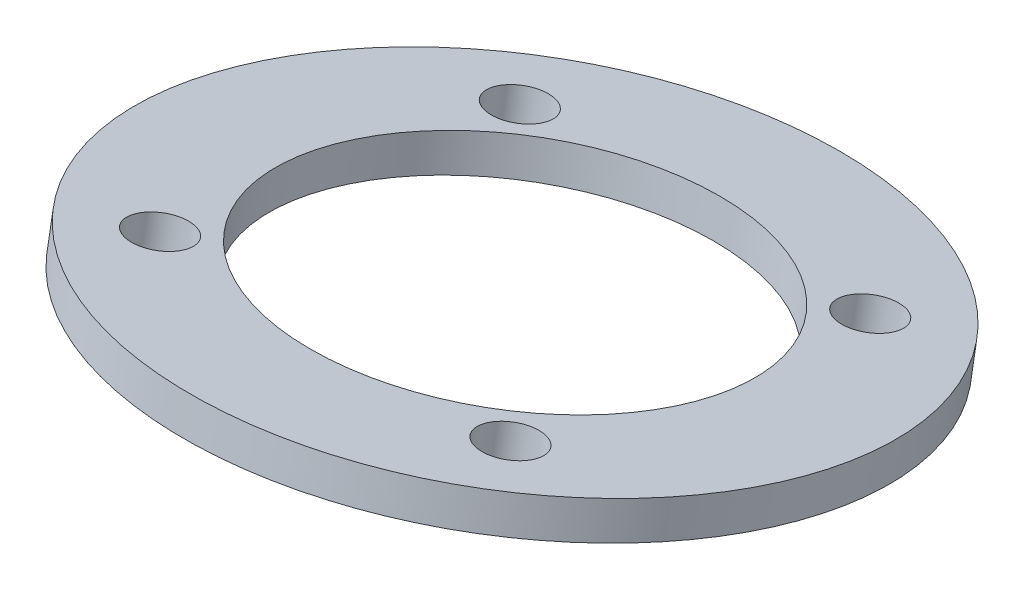
ISO-10303-21;
HEADER;
FILE_DESCRIPTION(('STEP AP214'),'2;1');
FILE_NAME('part.step','',(''),(''),'','','');
FILE_SCHEMA(('AUTOMOTIVE_DESIGN { 1 0 10303 214 1 1 1 1 }'));
ENDSEC;
DATA;
#1=APPLICATION_CONTEXT('core data for automotive mechanical design processes');
#2=APPLICATION_PROTOCOL_DEFINITION('international standard','automotive_design',2000,#1);
#3=PRODUCT_CONTEXT('',#1,'mechanical');
#4=PRODUCT('Part','Part','',(#3));
#5=PRODUCT_RELATED_PRODUCT_CATEGORY('part','',(#4));
#6=PRODUCT_DEFINITION_FORMATION('','',#4);
#7=PRODUCT_DEFINITION_CONTEXT('part definition',#1,'design');
#8=PRODUCT_DEFINITION('design','',#6,#7);
#9=PRODUCT_DEFINITION_SHAPE('','',#8);
#10=(LENGTH_UNIT() NAMED_UNIT(*) SI_UNIT(.MILLI.,.METRE.));
#11=(NAMED_UNIT(*) PLANE_ANGLE_UNIT() SI_UNIT($,.RADIAN.));
#12=(NAMED_UNIT(*) SI_UNIT($,.STERADIAN.) SOLID_ANGLE_UNIT());
#13=UNCERTAINTY_MEASURE_WITH_UNIT(LENGTH_MEASURE(1.E-05),#10,'distance_accuracy_value','');
#14=(GEOMETRIC_REPRESENTATION_CONTEXT(3) GLOBAL_UNCERTAINTY_ASSIGNED_CONTEXT((#13)) GLOBAL_UNIT_ASSIGNED_CONTEXT((#10,
#11,#12)) REPRESENTATION_CONTEXT('',''));
#15=CARTESIAN_POINT('',(0.,0.,0.));
#16=DIRECTION('',(0.,0.,1.));
#17=DIRECTION('',(1.,0.,0.));
#18=AXIS2_PLACEMENT_3D('',#15,#16,#17);
#19=CARTESIAN_POINT('',(74.8061646971155,57.2883877175868,-190.252663549452));
#20=DIRECTION('',(0.,-0.984807753012208,0.173648177666931));
#21=DIRECTION('',(0.,-0.173648177666931,-0.984807753012208));
#22=AXIS2_PLACEMENT_3D('',#19,#20,#21);
#23=CYLINDRICAL_SURFACE('',#22,18.25);
#24=CARTESIAN_POINT('',(74.8061646971155,57.2883877175868,-190.252663549452));
#25=DIRECTION('',(0.,-0.984807753012208,0.173648177666931));
#26=DIRECTION('',(0.,-0.173648177666931,-0.984807753012208));
#27=AXIS2_PLACEMENT_3D('',#24,#25,#26);
#28=CIRCLE('',#27,18.25);
#29=CARTESIAN_POINT('',(74.8061646971155,54.1193084751653,-208.225405041925));
#30=VERTEX_POINT('',#29);
#31=EDGE_CURVE('E10',#30,#30,#28,.T.);
#32=ORIENTED_EDGE('',*,*,#31,.T.);
#33=EDGE_LOOP('',(#32));
#34=FACE_BOUND('',#33,.T.);
#35=CARTESIAN_POINT('',(74.8061646971155,55.3187722115624,-189.905367194119));
#36=DIRECTION('',(0.,-0.984807753012208,0.173648177666931));
#37=DIRECTION('',(0.,-0.173648177666931,-0.984807753012208));
#38=AXIS2_PLACEMENT_3D('',#35,#36,#37);
#39=CIRCLE('',#38,18.25);
#40=CARTESIAN_POINT('',(74.8061646971155,52.1496929691409,-207.878108686591));
#41=VERTEX_POINT('',#40);
#42=EDGE_CURVE('E40',#41,#41,#39,.T.);
#43=ORIENTED_EDGE('',*,*,#42,.F.);
#44=EDGE_LOOP('',(#43));
#45=FACE_BOUND('',#44,.T.);
#46=ADVANCED_FACE('F37',(#34,#45),#23,.T.);
#47=CARTESIAN_POINT('',(74.8061646971155,57.2883877175868,-190.252663549452));
#48=DIRECTION('',(0.,-0.984807753012208,0.173648177666931));
#49=DIRECTION('',(0.,-0.173648177666931,-0.984807753012208));
#50=AXIS2_PLACEMENT_3D('',#47,#48,#49);
#51=PLANE('',#50);
#52=CARTESIAN_POINT('',(65.1149396424661,55.5339381265722,-200.202641618409));
#53=DIRECTION('',(0.,-0.984807753012208,0.173648177666931));
#54=DIRECTION('',(0.,-0.173648177666931,-0.984807753012208));
#55=AXIS2_PLACEMENT_3D('',#52,#53,#54);
#56=CIRCLE('',#55,1.6);
#57=CARTESIAN_POINT('',(65.1149396424661,55.2561010423051,-201.778334023229));
#58=VERTEX_POINT('',#57);
#59=EDGE_CURVE('E70',#58,#58,#56,.T.);
#60=ORIENTED_EDGE('',*,*,#59,.T.);
#61=EDGE_LOOP('',(#60));
#62=FACE_BOUND('',#61,.T.);
#63=CARTESIAN_POINT('',(84.909637216014,55.6055241474868,-199.796657119457));
#64=DIRECTION('',(0.,-0.984807753012208,0.173648177666931));
#65=DIRECTION('',(0.,-0.173648177666931,-0.984807753012208));
#66=AXIS2_PLACEMENT_3D('',#63,#64,#65);
#67=CIRCLE('',#66,1.6);
#68=CARTESIAN_POINT('',(84.909637216014,55.3276870632198,-201.372349524277));
#69=VERTEX_POINT('',#68);
#70=EDGE_CURVE('E64',#69,#69,#67,.T.);
#71=ORIENTED_EDGE('',*,*,#70,.T.);
#72=EDGE_LOOP('',(#71));
#73=FACE_BOUND('',#72,.T.);
#74=CARTESIAN_POINT('',(84.4973897517651,59.0428373086014,-180.302685480495));
#75=DIRECTION('',(0.,-0.984807753012208,0.173648177666931));
#76=DIRECTION('',(0.,-0.173648177666931,-0.984807753012208));
#77=AXIS2_PLACEMENT_3D('',#74,#75,#76);
#78=CIRCLE('',#77,1.59999999999998);
#79=CARTESIAN_POINT('',(84.4973897517651,58.7650002243344,-181.878377885315));
#80=VERTEX_POINT('',#79);
#81=EDGE_CURVE('E58',#80,#80,#78,.T.);
#82=ORIENTED_EDGE('',*,*,#81,.T.);
#83=EDGE_LOOP('',(#82));
#84=FACE_BOUND('',#83,.T.);
#85=CARTESIAN_POINT('',(64.7026921782172,58.9712512876868,-180.708669979447));
#86=DIRECTION('',(0.,-0.984807753012208,0.173648177666931));
#87=DIRECTION('',(0.,-0.173648177666931,-0.984807753012208));
#88=AXIS2_PLACEMENT_3D('',#85,#86,#87);
#89=CIRCLE('',#88,1.6);
#90=CARTESIAN_POINT('',(64.7026921782172,58.6934142034197,-182.284362384267));
#91=VERTEX_POINT('',#90);
#92=EDGE_CURVE('E52',#91,#91,#89,.T.);
#93=ORIENTED_EDGE('',*,*,#92,.T.);
#94=EDGE_LOOP('',(#93));
#95=FACE_BOUND('',#94,.T.);
#96=CARTESIAN_POINT('',(74.8061646971155,57.2883877175868,-190.252663549452));
#97=DIRECTION('',(0.,-0.984807753012208,0.173648177666931));
#98=DIRECTION('',(0.,-0.173648177666931,-0.984807753012208));
#99=AXIS2_PLACEMENT_3D('',#96,#97,#98);
#100=CIRCLE('',#99,11.5);
#101=CARTESIAN_POINT('',(74.8061646971155,55.2914336744171,-201.577952709093));
#102=VERTEX_POINT('',#101);
#103=EDGE_CURVE('E47',#102,#102,#100,.T.);
#104=ORIENTED_EDGE('',*,*,#103,.T.);
#105=EDGE_LOOP('',(#104));
#106=FACE_BOUND('',#105,.T.);
#107=ORIENTED_EDGE('',*,*,#31,.F.);
#108=EDGE_LOOP('',(#107));
#109=FACE_BOUND('',#108,.T.);
#110=ADVANCED_FACE('F79',(#62,#73,#84,#95,#106,#109),#51,.F.);
#111=CARTESIAN_POINT('',(74.8061646971155,55.3187722115624,-189.905367194119));
#112=DIRECTION('',(0.,-0.984807753012208,0.173648177666931));
#113=DIRECTION('',(0.,-0.173648177666931,-0.984807753012208));
#114=AXIS2_PLACEMENT_3D('',#111,#112,#113);
#115=PLANE('',#114);
#116=CARTESIAN_POINT('',(65.1149396424661,53.5643226205478,-199.855345263075));
#117=DIRECTION('',(0.,-0.984807753012208,0.173648177666931));
#118=DIRECTION('',(0.,-0.173648177666931,-0.984807753012208));
#119=AXIS2_PLACEMENT_3D('',#116,#117,#118);
#120=CIRCLE('',#119,1.6);
#121=CARTESIAN_POINT('',(65.1149396424661,53.2864855362807,-201.431037667895));
#122=VERTEX_POINT('',#121);
#123=EDGE_CURVE('E73',#122,#122,#120,.T.);
#124=ORIENTED_EDGE('',*,*,#123,.F.);
#125=EDGE_LOOP('',(#124));
#126=FACE_BOUND('',#125,.T.);
#127=CARTESIAN_POINT('',(84.909637216014,53.6359086414624,-199.449360764123));
#128=DIRECTION('',(0.,-0.984807753012208,0.173648177666931));
#129=DIRECTION('',(0.,-0.173648177666931,-0.984807753012208));
#130=AXIS2_PLACEMENT_3D('',#127,#128,#129);
#131=CIRCLE('',#130,1.6);
#132=CARTESIAN_POINT('',(84.909637216014,53.3580715571953,-201.025053168943));
#133=VERTEX_POINT('',#132);
#134=EDGE_CURVE('E67',#133,#133,#131,.T.);
#135=ORIENTED_EDGE('',*,*,#134,.F.);
#136=EDGE_LOOP('',(#135));
#137=FACE_BOUND('',#136,.T.);
#138=CARTESIAN_POINT('',(84.4973897517651,57.073221802577,-179.955389125162));
#139=DIRECTION('',(0.,-0.984807753012208,0.173648177666931));
#140=DIRECTION('',(0.,-0.173648177666931,-0.984807753012208));
#141=AXIS2_PLACEMENT_3D('',#138,#139,#140);
#142=CIRCLE('',#141,1.59999999999998);
#143=CARTESIAN_POINT('',(84.4973897517651,56.7953847183099,-181.531081529981));
#144=VERTEX_POINT('',#143);
#145=EDGE_CURVE('E61',#144,#144,#142,.T.);
#146=ORIENTED_EDGE('',*,*,#145,.F.);
#147=EDGE_LOOP('',(#146));
#148=FACE_BOUND('',#147,.T.);
#149=CARTESIAN_POINT('',(64.7026921782172,57.0016357816624,-180.361373624114));
#150=DIRECTION('',(0.,-0.984807753012208,0.173648177666931));
#151=DIRECTION('',(0.,-0.173648177666931,-0.984807753012208));
#152=AXIS2_PLACEMENT_3D('',#149,#150,#151);
#153=CIRCLE('',#152,1.6);
#154=CARTESIAN_POINT('',(64.7026921782172,56.7237986973953,-181.937066028933));
#155=VERTEX_POINT('',#154);
#156=EDGE_CURVE('E55',#155,#155,#153,.T.);
#157=ORIENTED_EDGE('',*,*,#156,.F.);
#158=EDGE_LOOP('',(#157));
#159=FACE_BOUND('',#158,.T.);
#160=CARTESIAN_POINT('',(74.8061646971155,55.3187722115624,-189.905367194119));
#161=DIRECTION('',(0.,-0.984807753012208,0.173648177666931));
#162=DIRECTION('',(0.,-0.173648177666931,-0.984807753012208));
#163=AXIS2_PLACEMENT_3D('',#160,#161,#162);
#164=CIRCLE('',#163,11.5);
#165=CARTESIAN_POINT('',(74.8061646971155,53.3218181683927,-201.230656353759));
#166=VERTEX_POINT('',#165);
#167=EDGE_CURVE('E49',#166,#166,#164,.T.);
#168=ORIENTED_EDGE('',*,*,#167,.F.);
#169=EDGE_LOOP('',(#168));
#170=FACE_BOUND('',#169,.T.);
#171=ORIENTED_EDGE('',*,*,#42,.T.);
#172=EDGE_LOOP('',(#171));
#173=FACE_BOUND('',#172,.T.);
#174=ADVANCED_FACE('F89',(#126,#137,#148,#159,#170,#173),#115,.T.);
#175=CARTESIAN_POINT('',(74.8061646971155,57.2883877175868,-190.252663549452));
#176=DIRECTION('',(0.,-0.984807753012208,0.173648177666931));
#177=DIRECTION('',(0.,-0.173648177666931,-0.984807753012208));
#178=AXIS2_PLACEMENT_3D('',#175,#176,#177);
#179=CYLINDRICAL_SURFACE('',#178,11.5);
#180=ORIENTED_EDGE('',*,*,#103,.F.);
#181=EDGE_LOOP('',(#180));
#182=FACE_BOUND('',#181,.T.);
#183=ORIENTED_EDGE('',*,*,#167,.T.);
#184=EDGE_LOOP('',(#183));
#185=FACE_BOUND('',#184,.T.);
#186=ADVANCED_FACE('F92',(#182,#185),#179,.F.);
#187=CARTESIAN_POINT('',(64.7026921782172,58.9712512876868,-180.708669979447));
#188=DIRECTION('',(0.,-0.984807753012208,0.173648177666931));
#189=DIRECTION('',(0.,-0.173648177666931,-0.984807753012208));
#190=AXIS2_PLACEMENT_3D('',#187,#188,#189);
#191=CYLINDRICAL_SURFACE('',#190,1.6);
#192=ORIENTED_EDGE('',*,*,#92,.F.);
#193=EDGE_LOOP('',(#192));
#194=FACE_BOUND('',#193,.T.);
#195=ORIENTED_EDGE('',*,*,#156,.T.);
#196=EDGE_LOOP('',(#195));
#197=FACE_BOUND('',#196,.T.);
#198=ADVANCED_FACE('F113',(#194,#197),#191,.F.);
#199=CARTESIAN_POINT('',(84.4973897517651,59.0428373086014,-180.302685480495));
#200=DIRECTION('',(0.,-0.984807753012208,0.173648177666931));
#201=DIRECTION('',(0.,-0.173648177666931,-0.984807753012208));
#202=AXIS2_PLACEMENT_3D('',#199,#200,#201);
#203=CYLINDRICAL_SURFACE('',#202,1.59999999999998);
#204=ORIENTED_EDGE('',*,*,#81,.F.);
#205=EDGE_LOOP('',(#204));
#206=FACE_BOUND('',#205,.T.);
#207=ORIENTED_EDGE('',*,*,#145,.T.);
#208=EDGE_LOOP('',(#207));
#209=FACE_BOUND('',#208,.T.);
#210=ADVANCED_FACE('F117',(#206,#209),#203,.F.);
#211=CARTESIAN_POINT('',(84.909637216014,55.6055241474868,-199.796657119457));
#212=DIRECTION('',(0.,-0.984807753012208,0.173648177666931));
#213=DIRECTION('',(0.,-0.173648177666931,-0.984807753012208));
#214=AXIS2_PLACEMENT_3D('',#211,#212,#213);
#215=CYLINDRICAL_SURFACE('',#214,1.6);
#216=ORIENTED_EDGE('',*,*,#70,.F.);
#217=EDGE_LOOP('',(#216));
#218=FACE_BOUND('',#217,.T.);
#219=ORIENTED_EDGE('',*,*,#134,.T.);
#220=EDGE_LOOP('',(#219));
#221=FACE_BOUND('',#220,.T.);
#222=ADVANCED_FACE('F85',(#218,#221),#215,.F.);
#223=CARTESIAN_POINT('',(65.1149396424661,55.5339381265722,-200.202641618409));
#224=DIRECTION('',(0.,-0.984807753012208,0.173648177666931));
#225=DIRECTION('',(0.,-0.173648177666931,-0.984807753012208));
#226=AXIS2_PLACEMENT_3D('',#223,#224,#225);
#227=CYLINDRICAL_SURFACE('',#226,1.6);
#228=ORIENTED_EDGE('',*,*,#59,.F.);
#229=EDGE_LOOP('',(#228));
#230=FACE_BOUND('',#229,.T.);
#231=ORIENTED_EDGE('',*,*,#123,.T.);
#232=EDGE_LOOP('',(#231));
#233=FACE_BOUND('',#232,.T.);
#234=ADVANCED_FACE('F82',(#230,#233),#227,.F.);
#235=CLOSED_SHELL('',(#46,#110,#174,#186,#198,#210,#222,#234));
#236=MANIFOLD_SOLID_BREP('B2',#235);
#237=ADVANCED_BREP_SHAPE_REPRESENTATION('',(#18,#236),#14);
#238=SHAPE_DEFINITION_REPRESENTATION(#9,#237);
ENDSEC;
END-ISO-10303-21;
